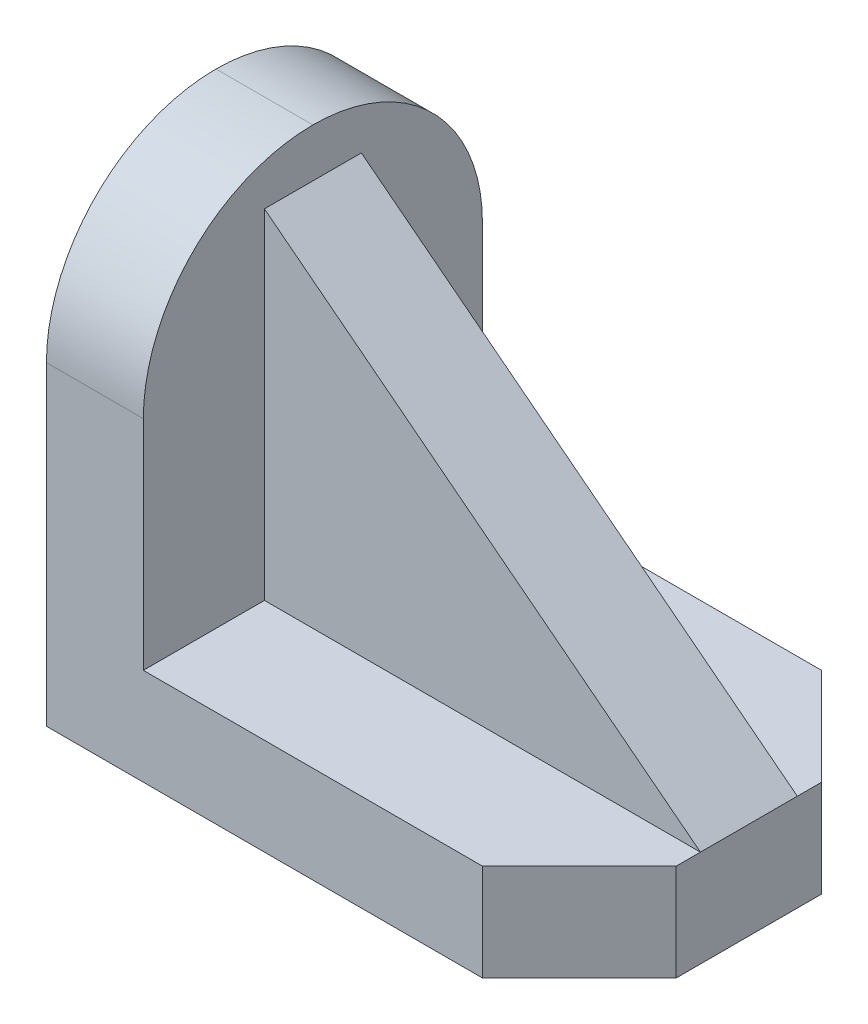
ISO-10303-21;
HEADER;
FILE_DESCRIPTION(('STEP AP214'),'2;1');
FILE_NAME('part.step','',(''),(''),'','','');
FILE_SCHEMA(('AUTOMOTIVE_DESIGN { 1 0 10303 214 1 1 1 1 }'));
ENDSEC;
DATA;
#1=APPLICATION_CONTEXT('core data for automotive mechanical design processes');
#2=APPLICATION_PROTOCOL_DEFINITION('international standard','automotive_design',2000,#1);
#3=PRODUCT_CONTEXT('',#1,'mechanical');
#4=PRODUCT('Part','Part','',(#3));
#5=PRODUCT_RELATED_PRODUCT_CATEGORY('part','',(#4));
#6=PRODUCT_DEFINITION_FORMATION('','',#4);
#7=PRODUCT_DEFINITION_CONTEXT('part definition',#1,'design');
#8=PRODUCT_DEFINITION('design','',#6,#7);
#9=PRODUCT_DEFINITION_SHAPE('','',#8);
#10=(LENGTH_UNIT() NAMED_UNIT(*) SI_UNIT(.MILLI.,.METRE.));
#11=(NAMED_UNIT(*) PLANE_ANGLE_UNIT() SI_UNIT($,.RADIAN.));
#12=(NAMED_UNIT(*) SI_UNIT($,.STERADIAN.) SOLID_ANGLE_UNIT());
#13=UNCERTAINTY_MEASURE_WITH_UNIT(LENGTH_MEASURE(1.E-05),#10,'distance_accuracy_value','');
#14=(GEOMETRIC_REPRESENTATION_CONTEXT(3) GLOBAL_UNCERTAINTY_ASSIGNED_CONTEXT((#13)) GLOBAL_UNIT_ASSIGNED_CONTEXT((#10,
#11,#12)) REPRESENTATION_CONTEXT('',''));
#15=CARTESIAN_POINT('',(0.,0.,0.));
#16=DIRECTION('',(0.,0.,1.));
#17=DIRECTION('',(1.,0.,0.));
#18=AXIS2_PLACEMENT_3D('',#15,#16,#17);
#19=CARTESIAN_POINT('',(0.,304.8,0.));
#20=DIRECTION('',(0.,-1.,0.));
#21=DIRECTION('',(0.,0.,-1.));
#22=AXIS2_PLACEMENT_3D('',#19,#20,#21);
#23=PLANE('',#22);
#24=DIRECTION('',(1.,0.,0.));
#25=VECTOR('',#24,1.);
#26=CARTESIAN_POINT('',(0.,304.8,0.));
#27=LINE('',#26,#25);
#28=CARTESIAN_POINT('',(304.8,304.8,0.));
#29=VERTEX_POINT('',#28);
#30=CARTESIAN_POINT('',(1371.6,304.8,0.));
#31=VERTEX_POINT('',#30);
#32=EDGE_CURVE('E187',#29,#31,#27,.T.);
#33=ORIENTED_EDGE('',*,*,#32,.T.);
#34=DIRECTION('',(-0.707106781186548,0.,0.707106781186547));
#35=VECTOR('',#34,1.);
#36=CARTESIAN_POINT('',(1676.4,304.8,-304.800000000001));
#37=LINE('',#36,#35);
#38=CARTESIAN_POINT('',(1676.4,304.8,-304.800000000001));
#39=VERTEX_POINT('',#38);
#40=EDGE_CURVE('E11',#31,#39,#37,.F.);
#41=ORIENTED_EDGE('',*,*,#40,.T.);
#42=DIRECTION('',(0.,0.,-1.));
#43=VECTOR('',#42,1.);
#44=CARTESIAN_POINT('',(1676.4,304.8,0.));
#45=LINE('',#44,#43);
#46=CARTESIAN_POINT('',(1676.4,304.8,-381.));
#47=VERTEX_POINT('',#46);
#48=EDGE_CURVE('E192',#39,#47,#45,.T.);
#49=ORIENTED_EDGE('',*,*,#48,.T.);
#50=DIRECTION('',(1.,0.,0.));
#51=VECTOR('',#50,1.);
#52=CARTESIAN_POINT('',(304.8,304.8,-381.));
#53=LINE('',#52,#51);
#54=CARTESIAN_POINT('',(304.8,304.8,-381.));
#55=VERTEX_POINT('',#54);
#56=EDGE_CURVE('E156',#55,#47,#53,.T.);
#57=ORIENTED_EDGE('',*,*,#56,.F.);
#58=DIRECTION('',(0.,0.,1.));
#59=VECTOR('',#58,1.);
#60=CARTESIAN_POINT('',(304.8,304.8,0.));
#61=LINE('',#60,#59);
#62=EDGE_CURVE('E163',#55,#29,#61,.T.);
#63=ORIENTED_EDGE('',*,*,#62,.T.);
#64=EDGE_LOOP('',(#33,#41,#49,#57,#63));
#65=FACE_BOUND('',#64,.T.);
#66=ADVANCED_FACE('F47',(#65),#23,.F.);
#67=CARTESIAN_POINT('',(1676.4,304.8,-685.8));
#68=VERTEX_POINT('',#67);
#69=CARTESIAN_POINT('',(1676.4,304.8,-761.999999999999));
#70=VERTEX_POINT('',#69);
#71=EDGE_CURVE('E190',#68,#70,#45,.T.);
#72=ORIENTED_EDGE('',*,*,#71,.T.);
#73=DIRECTION('',(0.707106781186548,0.,0.707106781186547));
#74=VECTOR('',#73,1.);
#75=CARTESIAN_POINT('',(1371.6,304.8,-1066.8));
#76=LINE('',#75,#74);
#77=CARTESIAN_POINT('',(1371.6,304.8,-1066.8));
#78=VERTEX_POINT('',#77);
#79=EDGE_CURVE('E253',#70,#78,#76,.F.);
#80=ORIENTED_EDGE('',*,*,#79,.T.);
#81=DIRECTION('',(-1.,0.,0.));
#82=VECTOR('',#81,1.);
#83=CARTESIAN_POINT('',(0.,304.8,-1066.8));
#84=LINE('',#83,#82);
#85=CARTESIAN_POINT('',(304.8,304.8,-1066.8));
#86=VERTEX_POINT('',#85);
#87=EDGE_CURVE('E195',#78,#86,#84,.T.);
#88=ORIENTED_EDGE('',*,*,#87,.T.);
#89=CARTESIAN_POINT('',(304.8,304.8,-685.8));
#90=VERTEX_POINT('',#89);
#91=EDGE_CURVE('E182',#86,#90,#61,.T.);
#92=ORIENTED_EDGE('',*,*,#91,.T.);
#93=DIRECTION('',(-1.,0.,0.));
#94=VECTOR('',#93,1.);
#95=CARTESIAN_POINT('',(304.8,304.8,-685.8));
#96=LINE('',#95,#94);
#97=EDGE_CURVE('E149',#68,#90,#96,.T.);
#98=ORIENTED_EDGE('',*,*,#97,.F.);
#99=EDGE_LOOP('',(#72,#80,#88,#92,#98));
#100=FACE_BOUND('',#99,.T.);
#101=ADVANCED_FACE('F303',(#100),#23,.F.);
#102=CARTESIAN_POINT('',(304.8,0.,0.));
#103=DIRECTION('',(1.,0.,0.));
#104=DIRECTION('',(0.,0.,-1.));
#105=AXIS2_PLACEMENT_3D('',#102,#103,#104);
#106=PLANE('',#105);
#107=CARTESIAN_POINT('',(304.8,990.6,-533.4));
#108=DIRECTION('',(1.,0.,0.));
#109=DIRECTION('',(0.,0.,-1.));
#110=AXIS2_PLACEMENT_3D('',#107,#108,#109);
#111=CIRCLE('',#110,533.4);
#112=CARTESIAN_POINT('',(304.8,990.6,-1066.8));
#113=VERTEX_POINT('',#112);
#114=CARTESIAN_POINT('',(304.8,1524.,-533.4));
#115=VERTEX_POINT('',#114);
#116=EDGE_CURVE('E230',#113,#115,#111,.T.);
#117=ORIENTED_EDGE('',*,*,#116,.T.);
#118=CARTESIAN_POINT('',(304.8,990.6,-533.4));
#119=DIRECTION('',(1.,0.,0.));
#120=DIRECTION('',(0.,0.,-1.));
#121=AXIS2_PLACEMENT_3D('',#118,#119,#120);
#122=CIRCLE('',#121,533.4);
#123=CARTESIAN_POINT('',(304.8,990.6,0.));
#124=VERTEX_POINT('',#123);
#125=EDGE_CURVE('E227',#115,#124,#122,.T.);
#126=ORIENTED_EDGE('',*,*,#125,.T.);
#127=DIRECTION('',(0.,1.,0.));
#128=VECTOR('',#127,1.);
#129=CARTESIAN_POINT('',(304.8,0.,0.));
#130=LINE('',#129,#128);
#131=EDGE_CURVE('E178',#29,#124,#130,.T.);
#132=ORIENTED_EDGE('',*,*,#131,.F.);
#133=ORIENTED_EDGE('',*,*,#62,.F.);
#134=DIRECTION('',(0.,-1.,0.));
#135=VECTOR('',#134,1.);
#136=CARTESIAN_POINT('',(304.8,1371.6,-381.));
#137=LINE('',#136,#135);
#138=CARTESIAN_POINT('',(304.8,1371.6,-381.));
#139=VERTEX_POINT('',#138);
#140=EDGE_CURVE('E155',#139,#55,#137,.T.);
#141=ORIENTED_EDGE('',*,*,#140,.F.);
#142=DIRECTION('',(0.,0.,1.));
#143=VECTOR('',#142,1.);
#144=CARTESIAN_POINT('',(304.8,1371.6,-685.8));
#145=LINE('',#144,#143);
#146=CARTESIAN_POINT('',(304.8,1371.6,-685.8));
#147=VERTEX_POINT('',#146);
#148=EDGE_CURVE('E137',#147,#139,#145,.T.);
#149=ORIENTED_EDGE('',*,*,#148,.F.);
#150=DIRECTION('',(0.,-1.,0.));
#151=VECTOR('',#150,1.);
#152=CARTESIAN_POINT('',(304.8,1371.6,-685.8));
#153=LINE('',#152,#151);
#154=EDGE_CURVE('E148',#147,#90,#153,.T.);
#155=ORIENTED_EDGE('',*,*,#154,.T.);
#156=ORIENTED_EDGE('',*,*,#91,.F.);
#157=DIRECTION('',(0.,-1.,0.));
#158=VECTOR('',#157,1.);
#159=CARTESIAN_POINT('',(304.8,0.,-1066.8));
#160=LINE('',#159,#158);
#161=EDGE_CURVE('E170',#113,#86,#160,.T.);
#162=ORIENTED_EDGE('',*,*,#161,.F.);
#163=EDGE_LOOP('',(#117,#126,#132,#133,#141,#149,#155,#156,#162));
#164=FACE_BOUND('',#163,.T.);
#165=ADVANCED_FACE('F161',(#164),#106,.T.);
#166=CARTESIAN_POINT('',(0.,304.8,0.));
#167=DIRECTION('',(1.,0.,0.));
#168=DIRECTION('',(0.,0.,-1.));
#169=AXIS2_PLACEMENT_3D('',#166,#167,#168);
#170=PLANE('',#169);
#171=CARTESIAN_POINT('',(0.,990.6,-533.4));
#172=DIRECTION('',(1.,0.,0.));
#173=DIRECTION('',(0.,0.,-1.));
#174=AXIS2_PLACEMENT_3D('',#171,#172,#173);
#175=CIRCLE('',#174,533.4);
#176=CARTESIAN_POINT('',(0.,990.6,0.));
#177=VERTEX_POINT('',#176);
#178=CARTESIAN_POINT('',(0.,1524.,-533.4));
#179=VERTEX_POINT('',#178);
#180=EDGE_CURVE('E217',#177,#179,#175,.F.);
#181=ORIENTED_EDGE('',*,*,#180,.T.);
#182=CARTESIAN_POINT('',(0.,990.6,-533.4));
#183=DIRECTION('',(1.,0.,0.));
#184=DIRECTION('',(0.,0.,-1.));
#185=AXIS2_PLACEMENT_3D('',#182,#183,#184);
#186=CIRCLE('',#185,533.4);
#187=CARTESIAN_POINT('',(0.,990.6,-1066.8));
#188=VERTEX_POINT('',#187);
#189=EDGE_CURVE('E220',#179,#188,#186,.F.);
#190=ORIENTED_EDGE('',*,*,#189,.T.);
#191=DIRECTION('',(0.,-1.,0.));
#192=VECTOR('',#191,1.);
#193=CARTESIAN_POINT('',(0.,304.8,-1066.8));
#194=LINE('',#193,#192);
#195=CARTESIAN_POINT('',(0.,0.,-1066.8));
#196=VERTEX_POINT('',#195);
#197=EDGE_CURVE('E198',#188,#196,#194,.T.);
#198=ORIENTED_EDGE('',*,*,#197,.T.);
#199=DIRECTION('',(0.,0.,1.));
#200=VECTOR('',#199,1.);
#201=CARTESIAN_POINT('',(0.,0.,0.));
#202=LINE('',#201,#200);
#203=CARTESIAN_POINT('',(0.,0.,0.));
#204=VERTEX_POINT('',#203);
#205=EDGE_CURVE('E186',#196,#204,#202,.T.);
#206=ORIENTED_EDGE('',*,*,#205,.T.);
#207=DIRECTION('',(0.,-1.,0.));
#208=VECTOR('',#207,1.);
#209=CARTESIAN_POINT('',(0.,304.8,0.));
#210=LINE('',#209,#208);
#211=EDGE_CURVE('E214',#177,#204,#210,.T.);
#212=ORIENTED_EDGE('',*,*,#211,.F.);
#213=EDGE_LOOP('',(#181,#190,#198,#206,#212));
#214=FACE_BOUND('',#213,.T.);
#215=ADVANCED_FACE('F273',(#214),#170,.F.);
#216=CARTESIAN_POINT('',(0.,304.8,0.));
#217=DIRECTION('',(0.,0.,-1.));
#218=DIRECTION('',(-1.,0.,0.));
#219=AXIS2_PLACEMENT_3D('',#216,#217,#218);
#220=PLANE('',#219);
#221=DIRECTION('',(1.,0.,0.));
#222=VECTOR('',#221,1.);
#223=CARTESIAN_POINT('',(0.,0.,0.));
#224=LINE('',#223,#222);
#225=CARTESIAN_POINT('',(1371.6,0.,0.));
#226=VERTEX_POINT('',#225);
#227=EDGE_CURVE('E202',#204,#226,#224,.T.);
#228=ORIENTED_EDGE('',*,*,#227,.T.);
#229=DIRECTION('',(0.,1.,0.));
#230=VECTOR('',#229,1.);
#231=CARTESIAN_POINT('',(1371.6,304.8,0.));
#232=LINE('',#231,#230);
#233=EDGE_CURVE('E57',#226,#31,#232,.T.);
#234=ORIENTED_EDGE('',*,*,#233,.T.);
#235=ORIENTED_EDGE('',*,*,#32,.F.);
#236=ORIENTED_EDGE('',*,*,#131,.T.);
#237=DIRECTION('',(-1.,0.,0.));
#238=VECTOR('',#237,1.);
#239=CARTESIAN_POINT('',(0.,990.6,0.));
#240=LINE('',#239,#238);
#241=EDGE_CURVE('E233',#124,#177,#240,.T.);
#242=ORIENTED_EDGE('',*,*,#241,.T.);
#243=ORIENTED_EDGE('',*,*,#211,.T.);
#244=EDGE_LOOP('',(#228,#234,#235,#236,#242,#243));
#245=FACE_BOUND('',#244,.T.);
#246=ADVANCED_FACE('F259',(#245),#220,.F.);
#247=CARTESIAN_POINT('',(1676.4,304.8,0.));
#248=DIRECTION('',(-1.,0.,0.));
#249=DIRECTION('',(0.,0.,1.));
#250=AXIS2_PLACEMENT_3D('',#247,#248,#249);
#251=PLANE('',#250);
#252=DIRECTION('',(0.,0.,-1.));
#253=VECTOR('',#252,1.);
#254=CARTESIAN_POINT('',(1676.4,0.,0.));
#255=LINE('',#254,#253);
#256=CARTESIAN_POINT('',(1676.4,0.,-304.800000000001));
#257=VERTEX_POINT('',#256);
#258=CARTESIAN_POINT('',(1676.4,0.,-761.999999999999));
#259=VERTEX_POINT('',#258);
#260=EDGE_CURVE('E205',#257,#259,#255,.T.);
#261=ORIENTED_EDGE('',*,*,#260,.T.);
#262=DIRECTION('',(0.,1.,0.));
#263=VECTOR('',#262,1.);
#264=CARTESIAN_POINT('',(1676.4,304.8,-761.999999999999));
#265=LINE('',#264,#263);
#266=EDGE_CURVE('E250',#259,#70,#265,.T.);
#267=ORIENTED_EDGE('',*,*,#266,.T.);
#268=ORIENTED_EDGE('',*,*,#71,.F.);
#269=DIRECTION('',(0.,0.,1.));
#270=VECTOR('',#269,1.);
#271=CARTESIAN_POINT('',(1676.4,304.8,-1447.8));
#272=LINE('',#271,#270);
#273=EDGE_CURVE('E158',#68,#47,#272,.T.);
#274=ORIENTED_EDGE('',*,*,#273,.T.);
#275=ORIENTED_EDGE('',*,*,#48,.F.);
#276=DIRECTION('',(0.,-1.,0.));
#277=VECTOR('',#276,1.);
#278=CARTESIAN_POINT('',(1676.4,304.8,-304.800000000001));
#279=LINE('',#278,#277);
#280=EDGE_CURVE('E246',#39,#257,#279,.T.);
#281=ORIENTED_EDGE('',*,*,#280,.T.);
#282=EDGE_LOOP('',(#261,#267,#268,#274,#275,#281));
#283=FACE_BOUND('',#282,.T.);
#284=ADVANCED_FACE('F288',(#283),#251,.F.);
#285=CARTESIAN_POINT('',(0.,304.8,-1066.8));
#286=DIRECTION('',(0.,0.,1.));
#287=DIRECTION('',(1.,0.,0.));
#288=AXIS2_PLACEMENT_3D('',#285,#286,#287);
#289=PLANE('',#288);
#290=ORIENTED_EDGE('',*,*,#87,.F.);
#291=DIRECTION('',(0.,-1.,0.));
#292=VECTOR('',#291,1.);
#293=CARTESIAN_POINT('',(1371.6,304.8,-1066.8));
#294=LINE('',#293,#292);
#295=CARTESIAN_POINT('',(1371.6,0.,-1066.8));
#296=VERTEX_POINT('',#295);
#297=EDGE_CURVE('E235',#78,#296,#294,.T.);
#298=ORIENTED_EDGE('',*,*,#297,.T.);
#299=DIRECTION('',(-1.,0.,0.));
#300=VECTOR('',#299,1.);
#301=CARTESIAN_POINT('',(0.,0.,-1066.8));
#302=LINE('',#301,#300);
#303=EDGE_CURVE('E191',#296,#196,#302,.T.);
#304=ORIENTED_EDGE('',*,*,#303,.T.);
#305=ORIENTED_EDGE('',*,*,#197,.F.);
#306=DIRECTION('',(-1.,0.,0.));
#307=VECTOR('',#306,1.);
#308=CARTESIAN_POINT('',(304.8,990.6,-1066.8));
#309=LINE('',#308,#307);
#310=EDGE_CURVE('E223',#188,#113,#309,.F.);
#311=ORIENTED_EDGE('',*,*,#310,.T.);
#312=ORIENTED_EDGE('',*,*,#161,.T.);
#313=EDGE_LOOP('',(#290,#298,#304,#305,#311,#312));
#314=FACE_BOUND('',#313,.T.);
#315=ADVANCED_FACE('F278',(#314),#289,.F.);
#316=CARTESIAN_POINT('',(0.,0.,0.));
#317=DIRECTION('',(0.,-1.,0.));
#318=DIRECTION('',(0.,0.,-1.));
#319=AXIS2_PLACEMENT_3D('',#316,#317,#318);
#320=PLANE('',#319);
#321=ORIENTED_EDGE('',*,*,#303,.F.);
#322=DIRECTION('',(-0.707106781186548,0.,-0.707106781186547));
#323=VECTOR('',#322,1.);
#324=CARTESIAN_POINT('',(1219.2,0.,-1219.2));
#325=LINE('',#324,#323);
#326=EDGE_CURVE('E243',#296,#259,#325,.F.);
#327=ORIENTED_EDGE('',*,*,#326,.T.);
#328=ORIENTED_EDGE('',*,*,#260,.F.);
#329=DIRECTION('',(0.707106781186548,0.,-0.707106781186547));
#330=VECTOR('',#329,1.);
#331=CARTESIAN_POINT('',(685.799999999998,0.,685.799999999999));
#332=LINE('',#331,#330);
#333=EDGE_CURVE('E240',#257,#226,#332,.F.);
#334=ORIENTED_EDGE('',*,*,#333,.T.);
#335=ORIENTED_EDGE('',*,*,#227,.F.);
#336=ORIENTED_EDGE('',*,*,#205,.F.);
#337=EDGE_LOOP('',(#321,#327,#328,#334,#335,#336));
#338=FACE_BOUND('',#337,.T.);
#339=ADVANCED_FACE('F282',(#338),#320,.T.);
#340=CARTESIAN_POINT('',(0.,990.6,-533.4));
#341=DIRECTION('',(1.,0.,0.));
#342=DIRECTION('',(0.,0.,-1.));
#343=AXIS2_PLACEMENT_3D('',#340,#341,#342);
#344=CYLINDRICAL_SURFACE('',#343,533.4);
#345=ORIENTED_EDGE('',*,*,#241,.F.);
#346=ORIENTED_EDGE('',*,*,#125,.F.);
#347=DIRECTION('',(-1.,0.,0.));
#348=VECTOR('',#347,1.);
#349=CARTESIAN_POINT('',(304.8,1524.,-533.4));
#350=LINE('',#349,#348);
#351=EDGE_CURVE('E165',#179,#115,#350,.F.);
#352=ORIENTED_EDGE('',*,*,#351,.F.);
#353=ORIENTED_EDGE('',*,*,#180,.F.);
#354=EDGE_LOOP('',(#345,#346,#352,#353));
#355=FACE_BOUND('',#354,.T.);
#356=ADVANCED_FACE('F265',(#355),#344,.T.);
#357=CARTESIAN_POINT('',(304.8,990.6,-533.4));
#358=DIRECTION('',(1.,0.,0.));
#359=DIRECTION('',(0.,0.,-1.));
#360=AXIS2_PLACEMENT_3D('',#357,#358,#359);
#361=CYLINDRICAL_SURFACE('',#360,533.4);
#362=ORIENTED_EDGE('',*,*,#116,.F.);
#363=ORIENTED_EDGE('',*,*,#310,.F.);
#364=ORIENTED_EDGE('',*,*,#189,.F.);
#365=ORIENTED_EDGE('',*,*,#351,.T.);
#366=EDGE_LOOP('',(#362,#363,#364,#365));
#367=FACE_BOUND('',#366,.T.);
#368=ADVANCED_FACE('F269',(#367),#361,.T.);
#369=CARTESIAN_POINT('',(304.8,1371.6,-381.));
#370=DIRECTION('',(0.,0.,-1.));
#371=DIRECTION('',(-1.,0.,0.));
#372=AXIS2_PLACEMENT_3D('',#369,#370,#371);
#373=PLANE('',#372);
#374=ORIENTED_EDGE('',*,*,#56,.T.);
#375=DIRECTION('',(0.789352217376326,-0.61394061351492,0.));
#376=VECTOR('',#375,1.);
#377=CARTESIAN_POINT('',(304.8,1371.6,-381.));
#378=LINE('',#377,#376);
#379=EDGE_CURVE('E140',#139,#47,#378,.T.);
#380=ORIENTED_EDGE('',*,*,#379,.F.);
#381=ORIENTED_EDGE('',*,*,#140,.T.);
#382=EDGE_LOOP('',(#374,#380,#381));
#383=FACE_BOUND('',#382,.T.);
#384=ADVANCED_FACE('F154',(#383),#373,.F.);
#385=CARTESIAN_POINT('',(304.8,1371.6,-685.8));
#386=DIRECTION('',(0.,0.,1.));
#387=DIRECTION('',(1.,0.,0.));
#388=AXIS2_PLACEMENT_3D('',#385,#386,#387);
#389=PLANE('',#388);
#390=ORIENTED_EDGE('',*,*,#154,.F.);
#391=DIRECTION('',(0.789352217376326,-0.613940613514921,0.));
#392=VECTOR('',#391,1.);
#393=CARTESIAN_POINT('',(304.8,1371.6,-685.8));
#394=LINE('',#393,#392);
#395=EDGE_CURVE('E143',#147,#68,#394,.T.);
#396=ORIENTED_EDGE('',*,*,#395,.T.);
#397=ORIENTED_EDGE('',*,*,#97,.T.);
#398=EDGE_LOOP('',(#390,#396,#397));
#399=FACE_BOUND('',#398,.T.);
#400=ADVANCED_FACE('F301',(#399),#389,.F.);
#401=CARTESIAN_POINT('',(304.8,1371.6,-1447.8));
#402=DIRECTION('',(-0.61394061351492,-0.789352217376326,0.));
#403=DIRECTION('',(0.789352217376326,-0.613940613514921,0.));
#404=AXIS2_PLACEMENT_3D('',#401,#402,#403);
#405=PLANE('',#404);
#406=ORIENTED_EDGE('',*,*,#148,.T.);
#407=ORIENTED_EDGE('',*,*,#379,.T.);
#408=ORIENTED_EDGE('',*,*,#273,.F.);
#409=ORIENTED_EDGE('',*,*,#395,.F.);
#410=EDGE_LOOP('',(#406,#407,#408,#409));
#411=FACE_BOUND('',#410,.T.);
#412=ADVANCED_FACE('F139',(#411),#405,.F.);
#413=CARTESIAN_POINT('',(1371.6,304.8,-1066.8));
#414=DIRECTION('',(-0.707106781186547,0.,0.707106781186548));
#415=DIRECTION('',(0.,-1.,0.));
#416=AXIS2_PLACEMENT_3D('',#413,#414,#415);
#417=PLANE('',#416);
#418=ORIENTED_EDGE('',*,*,#79,.F.);
#419=ORIENTED_EDGE('',*,*,#266,.F.);
#420=ORIENTED_EDGE('',*,*,#326,.F.);
#421=ORIENTED_EDGE('',*,*,#297,.F.);
#422=EDGE_LOOP('',(#418,#419,#420,#421));
#423=FACE_BOUND('',#422,.T.);
#424=ADVANCED_FACE('F307',(#423),#417,.F.);
#425=CARTESIAN_POINT('',(1676.4,304.8,-304.800000000001));
#426=DIRECTION('',(-0.707106781186547,0.,-0.707106781186548));
#427=DIRECTION('',(0.,-1.,0.));
#428=AXIS2_PLACEMENT_3D('',#425,#426,#427);
#429=PLANE('',#428);
#430=ORIENTED_EDGE('',*,*,#40,.F.);
#431=ORIENTED_EDGE('',*,*,#233,.F.);
#432=ORIENTED_EDGE('',*,*,#333,.F.);
#433=ORIENTED_EDGE('',*,*,#280,.F.);
#434=EDGE_LOOP('',(#430,#431,#432,#433));
#435=FACE_BOUND('',#434,.T.);
#436=ADVANCED_FACE('F50',(#435),#429,.F.);
#437=CLOSED_SHELL('',(#66,#101,#165,#215,#246,#284,#315,#339,#356,#368,#384,#400,#412,#424,#436));
#438=MANIFOLD_SOLID_BREP('B2',#437);
#439=ADVANCED_BREP_SHAPE_REPRESENTATION('',(#18,#438),#14);
#440=SHAPE_DEFINITION_REPRESENTATION(#9,#439);
ENDSEC;
END-ISO-10303-21;
